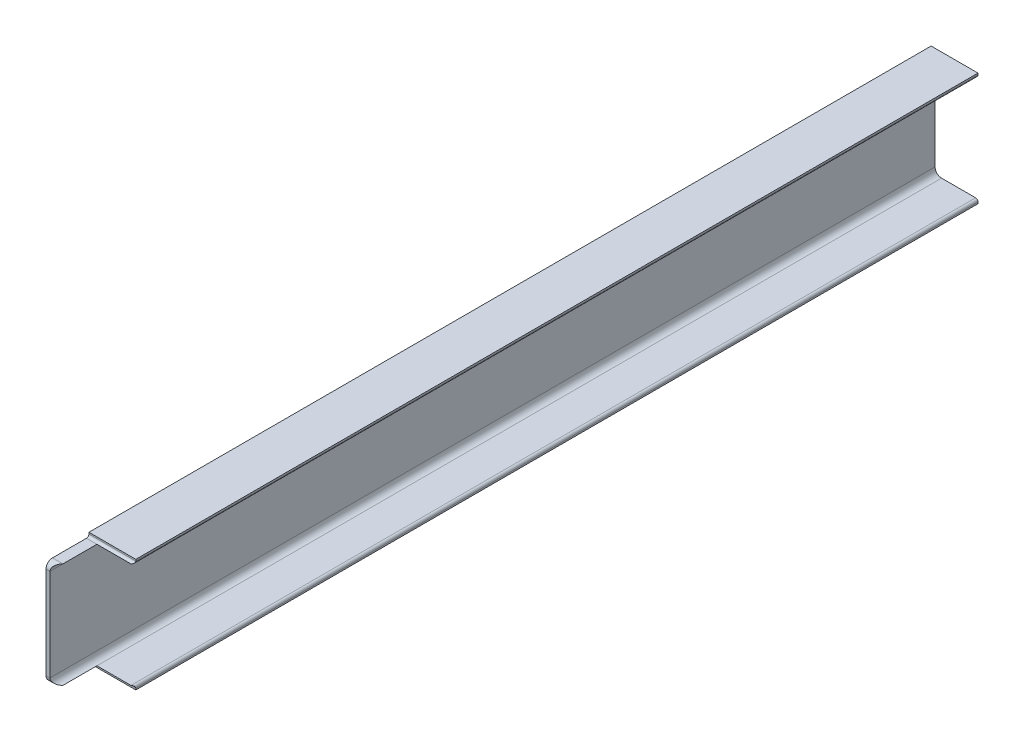
ISO-10303-21;
HEADER;
FILE_DESCRIPTION(('STEP AP214'),'2;1');
FILE_NAME('part.step','',(''),(''),'','','');
FILE_SCHEMA(('AUTOMOTIVE_DESIGN { 1 0 10303 214 1 1 1 1 }'));
ENDSEC;
DATA;
#1=APPLICATION_CONTEXT('core data for automotive mechanical design processes');
#2=APPLICATION_PROTOCOL_DEFINITION('international standard','automotive_design',2000,#1);
#3=PRODUCT_CONTEXT('',#1,'mechanical');
#4=PRODUCT('Part','Part','',(#3));
#5=PRODUCT_RELATED_PRODUCT_CATEGORY('part','',(#4));
#6=PRODUCT_DEFINITION_FORMATION('','',#4);
#7=PRODUCT_DEFINITION_CONTEXT('part definition',#1,'design');
#8=PRODUCT_DEFINITION('design','',#6,#7);
#9=PRODUCT_DEFINITION_SHAPE('','',#8);
#10=(LENGTH_UNIT() NAMED_UNIT(*) SI_UNIT(.MILLI.,.METRE.));
#11=(NAMED_UNIT(*) PLANE_ANGLE_UNIT() SI_UNIT($,.RADIAN.));
#12=(NAMED_UNIT(*) SI_UNIT($,.STERADIAN.) SOLID_ANGLE_UNIT());
#13=UNCERTAINTY_MEASURE_WITH_UNIT(LENGTH_MEASURE(1.E-05),#10,'distance_accuracy_value','');
#14=(GEOMETRIC_REPRESENTATION_CONTEXT(3) GLOBAL_UNCERTAINTY_ASSIGNED_CONTEXT((#13)) GLOBAL_UNIT_ASSIGNED_CONTEXT((#10,
#11,#12)) REPRESENTATION_CONTEXT('',''));
#15=CARTESIAN_POINT('',(0.,0.,0.));
#16=DIRECTION('',(0.,0.,1.));
#17=DIRECTION('',(1.,0.,0.));
#18=AXIS2_PLACEMENT_3D('',#15,#16,#17);
#19=CARTESIAN_POINT('',(0.,0.,-1100.));
#20=DIRECTION('',(0.,1.,0.));
#21=DIRECTION('',(-1.,0.,0.));
#22=AXIS2_PLACEMENT_3D('',#19,#20,#21);
#23=PLANE('',#22);
#24=DIRECTION('',(0.,0.,1.));
#25=VECTOR('',#24,1.);
#26=CARTESIAN_POINT('',(0.,0.,-1100.));
#27=LINE('',#26,#25);
#28=CARTESIAN_POINT('',(0.,0.,-1100.));
#29=VERTEX_POINT('',#28);
#30=CARTESIAN_POINT('',(0.,0.,-58.0000000000239));
#31=VERTEX_POINT('',#30);
#32=EDGE_CURVE('E207',#29,#31,#27,.T.);
#33=ORIENTED_EDGE('',*,*,#32,.T.);
#34=DIRECTION('',(-1.,0.,0.));
#35=VECTOR('',#34,1.);
#36=CARTESIAN_POINT('',(1603.56728673064,0.,-58.0000000000001));
#37=LINE('',#36,#35);
#38=CARTESIAN_POINT('',(58.,0.,-58.0000000000001));
#39=VERTEX_POINT('',#38);
#40=EDGE_CURVE('E67',#39,#31,#37,.T.);
#41=ORIENTED_EDGE('',*,*,#40,.F.);
#42=DIRECTION('',(0.,0.,1.));
#43=VECTOR('',#42,1.);
#44=CARTESIAN_POINT('',(58.,0.,-1100.));
#45=LINE('',#44,#43);
#46=CARTESIAN_POINT('',(58.,0.,-1100.));
#47=VERTEX_POINT('',#46);
#48=EDGE_CURVE('E74',#47,#39,#45,.T.);
#49=ORIENTED_EDGE('',*,*,#48,.F.);
#50=DIRECTION('',(-1.,0.,0.));
#51=VECTOR('',#50,1.);
#52=CARTESIAN_POINT('',(0.,0.,-1100.));
#53=LINE('',#52,#51);
#54=EDGE_CURVE('E192',#47,#29,#53,.T.);
#55=ORIENTED_EDGE('',*,*,#54,.T.);
#56=EDGE_LOOP('',(#33,#41,#49,#55));
#57=FACE_BOUND('',#56,.T.);
#58=ADVANCED_FACE('F52',(#57),#23,.T.);
#59=CARTESIAN_POINT('',(58.,0.,-1100.));
#60=DIRECTION('',(1.,0.,0.));
#61=DIRECTION('',(0.,1.,0.));
#62=AXIS2_PLACEMENT_3D('',#59,#60,#61);
#63=PLANE('',#62);
#64=ORIENTED_EDGE('',*,*,#48,.T.);
#65=DIRECTION('',(0.,-1.,0.));
#66=VECTOR('',#65,1.);
#67=CARTESIAN_POINT('',(58.,0.,-58.0000000000002));
#68=LINE('',#67,#66);
#69=CARTESIAN_POINT('',(58.,-1.90000000000001,-58.0000000000002));
#70=VERTEX_POINT('',#69);
#71=EDGE_CURVE('E181',#39,#70,#68,.T.);
#72=ORIENTED_EDGE('',*,*,#71,.T.);
#73=DIRECTION('',(0.,0.,1.));
#74=VECTOR('',#73,1.);
#75=CARTESIAN_POINT('',(58.,-1.90000000000001,-1100.));
#76=LINE('',#75,#74);
#77=CARTESIAN_POINT('',(58.,-1.90000000000001,-1100.));
#78=VERTEX_POINT('',#77);
#79=EDGE_CURVE('E332',#78,#70,#76,.T.);
#80=ORIENTED_EDGE('',*,*,#79,.F.);
#81=DIRECTION('',(0.,1.,0.));
#82=VECTOR('',#81,1.);
#83=CARTESIAN_POINT('',(58.,0.,-1100.));
#84=LINE('',#83,#82);
#85=EDGE_CURVE('E214',#78,#47,#84,.T.);
#86=ORIENTED_EDGE('',*,*,#85,.T.);
#87=EDGE_LOOP('',(#64,#72,#80,#86));
#88=FACE_BOUND('',#87,.T.);
#89=ADVANCED_FACE('F438',(#88),#63,.T.);
#90=CARTESIAN_POINT('',(54.9999999999999,-1.90000000000001,-1100.));
#91=DIRECTION('',(0.,0.,1.));
#92=DIRECTION('',(1.,0.,0.));
#93=AXIS2_PLACEMENT_3D('',#90,#91,#92);
#94=CYLINDRICAL_SURFACE('',#93,3.00000000000001);
#95=ORIENTED_EDGE('',*,*,#79,.T.);
#96=CARTESIAN_POINT('',(54.9999999999999,-1.90000000000001,-55.0000000000001));
#97=DIRECTION('',(0.707106781186548,0.,0.707106781186548));
#98=DIRECTION('',(-0.707106781186548,0.,0.707106781186548));
#99=AXIS2_PLACEMENT_3D('',#96,#97,#98);
#100=ELLIPSE('',#99,4.24264068711929,3.);
#101=CARTESIAN_POINT('',(54.9999999999999,-4.90000000000002,-55.0000000000001));
#102=VERTEX_POINT('',#101);
#103=EDGE_CURVE('E263',#70,#102,#100,.F.);
#104=ORIENTED_EDGE('',*,*,#103,.T.);
#105=DIRECTION('',(0.,0.,1.));
#106=VECTOR('',#105,1.);
#107=CARTESIAN_POINT('',(54.9999999999999,-4.90000000000002,-1100.));
#108=LINE('',#107,#106);
#109=CARTESIAN_POINT('',(54.9999999999999,-4.90000000000002,-1100.));
#110=VERTEX_POINT('',#109);
#111=EDGE_CURVE('E336',#110,#102,#108,.T.);
#112=ORIENTED_EDGE('',*,*,#111,.F.);
#113=CARTESIAN_POINT('',(54.9999999999999,-1.90000000000001,-1100.));
#114=DIRECTION('',(0.,0.,1.));
#115=DIRECTION('',(-1.,0.,0.));
#116=AXIS2_PLACEMENT_3D('',#113,#114,#115);
#117=CIRCLE('',#116,3.00000000000001);
#118=EDGE_CURVE('E323',#110,#78,#117,.T.);
#119=ORIENTED_EDGE('',*,*,#118,.T.);
#120=EDGE_LOOP('',(#95,#104,#112,#119));
#121=FACE_BOUND('',#120,.T.);
#122=ADVANCED_FACE('F440',(#121),#94,.T.);
#123=CARTESIAN_POINT('',(12.8999999999999,-12.9000000000001,-1100.));
#124=DIRECTION('',(0.,0.,1.));
#125=DIRECTION('',(1.,0.,0.));
#126=AXIS2_PLACEMENT_3D('',#123,#124,#125);
#127=CYLINDRICAL_SURFACE('',#126,8.);
#128=DIRECTION('',(0.,0.,1.));
#129=VECTOR('',#128,1.);
#130=CARTESIAN_POINT('',(12.8999999999999,-4.90000000000004,-1100.));
#131=LINE('',#130,#129);
#132=CARTESIAN_POINT('',(12.8999999999999,-4.90000000000002,-55.0000000000001));
#133=VERTEX_POINT('',#132);
#134=CARTESIAN_POINT('',(12.8999999999999,-4.90000000000002,-12.9));
#135=VERTEX_POINT('',#134);
#136=EDGE_CURVE('E267',#133,#135,#131,.T.);
#137=ORIENTED_EDGE('',*,*,#136,.T.);
#138=CARTESIAN_POINT('',(12.8999999999999,-12.9,-12.9));
#139=DIRECTION('',(0.707106781186548,0.,0.707106781186548));
#140=DIRECTION('',(-0.707106781186548,0.,0.707106781186548));
#141=AXIS2_PLACEMENT_3D('',#138,#139,#140);
#142=ELLIPSE('',#141,11.3137084989848,8.);
#143=CARTESIAN_POINT('',(4.8999999999999,-12.9,-4.9));
#144=VERTEX_POINT('',#143);
#145=EDGE_CURVE('E271',#135,#144,#142,.T.);
#146=ORIENTED_EDGE('',*,*,#145,.T.);
#147=DIRECTION('',(0.,0.,1.));
#148=VECTOR('',#147,1.);
#149=CARTESIAN_POINT('',(4.8999999999999,-12.9000000000001,-1100.));
#150=LINE('',#149,#148);
#151=CARTESIAN_POINT('',(4.8999999999999,-12.9000000000001,-1100.));
#152=VERTEX_POINT('',#151);
#153=EDGE_CURVE('E344',#152,#144,#150,.T.);
#154=ORIENTED_EDGE('',*,*,#153,.F.);
#155=CARTESIAN_POINT('',(12.8999999999999,-12.9000000000001,-1100.));
#156=DIRECTION('',(0.,0.,-1.));
#157=DIRECTION('',(1.,0.,0.));
#158=AXIS2_PLACEMENT_3D('',#155,#156,#157);
#159=CIRCLE('',#158,8.);
#160=CARTESIAN_POINT('',(12.8999999999999,-4.90000000000004,-1100.));
#161=VERTEX_POINT('',#160);
#162=EDGE_CURVE('E315',#152,#161,#159,.T.);
#163=ORIENTED_EDGE('',*,*,#162,.T.);
#164=DIRECTION('',(0.,0.,1.));
#165=VECTOR('',#164,1.);
#166=CARTESIAN_POINT('',(12.8999999999999,-4.90000000000004,-1100.));
#167=LINE('',#166,#165);
#168=EDGE_CURVE('E340',#161,#133,#167,.T.);
#169=ORIENTED_EDGE('',*,*,#168,.T.);
#170=EDGE_LOOP('',(#137,#146,#154,#163,#169));
#171=FACE_BOUND('',#170,.T.);
#172=ADVANCED_FACE('F422',(#171),#127,.F.);
#173=CARTESIAN_POINT('',(4.8999999999999,-12.9000000000001,-1100.));
#174=DIRECTION('',(1.,0.,0.));
#175=DIRECTION('',(0.,1.,0.));
#176=AXIS2_PLACEMENT_3D('',#173,#174,#175);
#177=PLANE('',#176);
#178=ORIENTED_EDGE('',*,*,#153,.T.);
#179=DIRECTION('',(0.,-1.,0.));
#180=VECTOR('',#179,1.);
#181=CARTESIAN_POINT('',(4.8999999999999,-12.9000000000002,-4.89999999999991));
#182=LINE('',#181,#180);
#183=CARTESIAN_POINT('',(4.8999999999999,-127.1,-4.89999999999991));
#184=VERTEX_POINT('',#183);
#185=EDGE_CURVE('E275',#144,#184,#182,.T.);
#186=ORIENTED_EDGE('',*,*,#185,.T.);
#187=DIRECTION('',(0.,0.,1.));
#188=VECTOR('',#187,1.);
#189=CARTESIAN_POINT('',(4.8999999999999,-127.1,-1100.));
#190=LINE('',#189,#188);
#191=CARTESIAN_POINT('',(4.8999999999999,-127.1,-1100.));
#192=VERTEX_POINT('',#191);
#193=EDGE_CURVE('E348',#192,#184,#190,.T.);
#194=ORIENTED_EDGE('',*,*,#193,.F.);
#195=DIRECTION('',(0.,1.,0.));
#196=VECTOR('',#195,1.);
#197=CARTESIAN_POINT('',(4.8999999999999,-12.9000000000001,-1100.));
#198=LINE('',#197,#196);
#199=EDGE_CURVE('E311',#192,#152,#198,.T.);
#200=ORIENTED_EDGE('',*,*,#199,.T.);
#201=EDGE_LOOP('',(#178,#186,#194,#200));
#202=FACE_BOUND('',#201,.T.);
#203=ADVANCED_FACE('F425',(#202),#177,.T.);
#204=CARTESIAN_POINT('',(12.8999999999999,-127.1,-1100.));
#205=DIRECTION('',(0.,0.,1.));
#206=DIRECTION('',(1.,0.,0.));
#207=AXIS2_PLACEMENT_3D('',#204,#205,#206);
#208=CYLINDRICAL_SURFACE('',#207,8.);
#209=ORIENTED_EDGE('',*,*,#193,.T.);
#210=CARTESIAN_POINT('',(12.8999999999999,-127.1,-12.9));
#211=DIRECTION('',(0.707106781186548,0.,0.707106781186548));
#212=DIRECTION('',(-0.707106781186548,0.,0.707106781186548));
#213=AXIS2_PLACEMENT_3D('',#210,#211,#212);
#214=ELLIPSE('',#213,11.3137084989848,8.);
#215=CARTESIAN_POINT('',(12.8999999999999,-135.1,-12.9));
#216=VERTEX_POINT('',#215);
#217=EDGE_CURVE('E279',#184,#216,#214,.T.);
#218=ORIENTED_EDGE('',*,*,#217,.T.);
#219=DIRECTION('',(0.,0.,1.));
#220=VECTOR('',#219,1.);
#221=CARTESIAN_POINT('',(12.8999999999999,-135.100000000001,-1100.));
#222=LINE('',#221,#220);
#223=CARTESIAN_POINT('',(12.8999999999999,-135.1,-55.));
#224=VERTEX_POINT('',#223);
#225=EDGE_CURVE('E283',#224,#216,#222,.T.);
#226=ORIENTED_EDGE('',*,*,#225,.F.);
#227=DIRECTION('',(0.,0.,1.));
#228=VECTOR('',#227,1.);
#229=CARTESIAN_POINT('',(12.8999999999999,-135.1,-1100.));
#230=LINE('',#229,#228);
#231=CARTESIAN_POINT('',(12.8999999999999,-135.1,-1100.));
#232=VERTEX_POINT('',#231);
#233=EDGE_CURVE('E352',#232,#224,#230,.T.);
#234=ORIENTED_EDGE('',*,*,#233,.F.);
#235=CARTESIAN_POINT('',(12.8999999999999,-127.1,-1100.));
#236=DIRECTION('',(0.,0.,-1.));
#237=DIRECTION('',(-1.,0.,0.));
#238=AXIS2_PLACEMENT_3D('',#235,#236,#237);
#239=CIRCLE('',#238,8.);
#240=EDGE_CURVE('E307',#232,#192,#239,.T.);
#241=ORIENTED_EDGE('',*,*,#240,.T.);
#242=EDGE_LOOP('',(#209,#218,#226,#234,#241));
#243=FACE_BOUND('',#242,.T.);
#244=ADVANCED_FACE('F371',(#243),#208,.F.);
#245=CARTESIAN_POINT('',(54.9999999999999,-135.1,-1100.));
#246=DIRECTION('',(0.,1.,0.));
#247=DIRECTION('',(-1.,0.,0.));
#248=AXIS2_PLACEMENT_3D('',#245,#246,#247);
#249=PLANE('',#248);
#250=ORIENTED_EDGE('',*,*,#233,.T.);
#251=DIRECTION('',(-1.,0.,0.));
#252=VECTOR('',#251,1.);
#253=CARTESIAN_POINT('',(1603.56728673064,-135.1,-55.));
#254=LINE('',#253,#252);
#255=CARTESIAN_POINT('',(54.9999999999999,-135.1,-55.));
#256=VERTEX_POINT('',#255);
#257=EDGE_CURVE('E253',#256,#224,#254,.T.);
#258=ORIENTED_EDGE('',*,*,#257,.F.);
#259=DIRECTION('',(0.,0.,1.));
#260=VECTOR('',#259,1.);
#261=CARTESIAN_POINT('',(54.9999999999999,-135.1,-1100.));
#262=LINE('',#261,#260);
#263=CARTESIAN_POINT('',(54.9999999999999,-135.1,-1100.));
#264=VERTEX_POINT('',#263);
#265=EDGE_CURVE('E205',#264,#256,#262,.T.);
#266=ORIENTED_EDGE('',*,*,#265,.F.);
#267=DIRECTION('',(-1.,0.,0.));
#268=VECTOR('',#267,1.);
#269=CARTESIAN_POINT('',(54.9999999999999,-135.1,-1100.));
#270=LINE('',#269,#268);
#271=EDGE_CURVE('E303',#264,#232,#270,.T.);
#272=ORIENTED_EDGE('',*,*,#271,.T.);
#273=EDGE_LOOP('',(#250,#258,#266,#272));
#274=FACE_BOUND('',#273,.T.);
#275=ADVANCED_FACE('F364',(#274),#249,.T.);
#276=CARTESIAN_POINT('',(54.9999999999999,-138.1,-1100.));
#277=DIRECTION('',(0.,0.,1.));
#278=DIRECTION('',(1.,0.,0.));
#279=AXIS2_PLACEMENT_3D('',#276,#277,#278);
#280=CYLINDRICAL_SURFACE('',#279,2.99999999999999);
#281=ORIENTED_EDGE('',*,*,#265,.T.);
#282=CARTESIAN_POINT('',(54.9999999999999,-138.1,-55.0000000000001));
#283=DIRECTION('',(0.707106781186548,0.,0.707106781186548));
#284=DIRECTION('',(-0.707106781186548,0.,0.707106781186548));
#285=AXIS2_PLACEMENT_3D('',#282,#283,#284);
#286=ELLIPSE('',#285,4.24264068711927,2.99999999999999);
#287=CARTESIAN_POINT('',(58.,-138.1,-58.0000000000001));
#288=VERTEX_POINT('',#287);
#289=EDGE_CURVE('E193',#256,#288,#286,.F.);
#290=ORIENTED_EDGE('',*,*,#289,.T.);
#291=DIRECTION('',(0.,0.,1.));
#292=VECTOR('',#291,1.);
#293=CARTESIAN_POINT('',(58.,-138.1,-1100.));
#294=LINE('',#293,#292);
#295=CARTESIAN_POINT('',(58.,-138.1,-1100.));
#296=VERTEX_POINT('',#295);
#297=EDGE_CURVE('E190',#296,#288,#294,.T.);
#298=ORIENTED_EDGE('',*,*,#297,.F.);
#299=CARTESIAN_POINT('',(54.9999999999999,-138.1,-1100.));
#300=DIRECTION('',(0.,0.,1.));
#301=DIRECTION('',(1.,0.,0.));
#302=AXIS2_PLACEMENT_3D('',#299,#300,#301);
#303=CIRCLE('',#302,2.99999999999999);
#304=EDGE_CURVE('E299',#296,#264,#303,.T.);
#305=ORIENTED_EDGE('',*,*,#304,.T.);
#306=EDGE_LOOP('',(#281,#290,#298,#305));
#307=FACE_BOUND('',#306,.T.);
#308=ADVANCED_FACE('F359',(#307),#280,.T.);
#309=CARTESIAN_POINT('',(0.,-140.,-1100.));
#310=DIRECTION('',(0.,-1.,0.));
#311=DIRECTION('',(0.,0.,-1.));
#312=AXIS2_PLACEMENT_3D('',#309,#310,#311);
#313=PLANE('',#312);
#314=DIRECTION('',(0.,0.,1.));
#315=VECTOR('',#314,1.);
#316=CARTESIAN_POINT('',(58.,-140.,-1100.));
#317=LINE('',#316,#315);
#318=CARTESIAN_POINT('',(58.,-140.,-1100.));
#319=VERTEX_POINT('',#318);
#320=CARTESIAN_POINT('',(58.,-140.,-58.0000000000001));
#321=VERTEX_POINT('',#320);
#322=EDGE_CURVE('E188',#319,#321,#317,.T.);
#323=ORIENTED_EDGE('',*,*,#322,.T.);
#324=DIRECTION('',(-1.,0.,0.));
#325=VECTOR('',#324,1.);
#326=CARTESIAN_POINT('',(1603.56728673064,-140.,-58.0000000000001));
#327=LINE('',#326,#325);
#328=CARTESIAN_POINT('',(0.,-140.,-58.0000000000001));
#329=VERTEX_POINT('',#328);
#330=EDGE_CURVE('E171',#321,#329,#327,.T.);
#331=ORIENTED_EDGE('',*,*,#330,.T.);
#332=DIRECTION('',(0.,0.,1.));
#333=VECTOR('',#332,1.);
#334=CARTESIAN_POINT('',(0.,-140.,-1100.));
#335=LINE('',#334,#333);
#336=CARTESIAN_POINT('',(0.,-140.,-1100.));
#337=VERTEX_POINT('',#336);
#338=EDGE_CURVE('E200',#337,#329,#335,.T.);
#339=ORIENTED_EDGE('',*,*,#338,.F.);
#340=DIRECTION('',(1.,0.,0.));
#341=VECTOR('',#340,1.);
#342=CARTESIAN_POINT('',(0.,-140.,-1100.));
#343=LINE('',#342,#341);
#344=EDGE_CURVE('E198',#337,#319,#343,.T.);
#345=ORIENTED_EDGE('',*,*,#344,.T.);
#346=EDGE_LOOP('',(#323,#331,#339,#345));
#347=FACE_BOUND('',#346,.T.);
#348=ADVANCED_FACE('F196',(#347),#313,.T.);
#349=CARTESIAN_POINT('',(0.,-140.,-1100.));
#350=DIRECTION('',(-1.,0.,0.));
#351=DIRECTION('',(0.,-1.,0.));
#352=AXIS2_PLACEMENT_3D('',#349,#350,#351);
#353=PLANE('',#352);
#354=ORIENTED_EDGE('',*,*,#338,.T.);
#355=DIRECTION('',(0.,1.,0.));
#356=VECTOR('',#355,1.);
#357=CARTESIAN_POINT('',(0.,-140.000000000008,-58.0000000000002));
#358=LINE('',#357,#356);
#359=CARTESIAN_POINT('',(0.,-138.1,-58.0000000000001));
#360=VERTEX_POINT('',#359);
#361=EDGE_CURVE('E13',#329,#360,#358,.T.);
#362=ORIENTED_EDGE('',*,*,#361,.T.);
#363=CARTESIAN_POINT('',(0.,-138.1,-55.0000000000001));
#364=DIRECTION('',(-1.,0.,0.));
#365=DIRECTION('',(0.,-1.,0.));
#366=AXIS2_PLACEMENT_3D('',#363,#364,#365);
#367=CIRCLE('',#366,2.99999999999999);
#368=CARTESIAN_POINT('',(0.,-135.1,-55.));
#369=VERTEX_POINT('',#368);
#370=EDGE_CURVE('E60',#360,#369,#367,.F.);
#371=ORIENTED_EDGE('',*,*,#370,.T.);
#372=DIRECTION('',(0.,0.,1.));
#373=VECTOR('',#372,1.);
#374=CARTESIAN_POINT('',(0.,-135.100000000003,-1100.));
#375=LINE('',#374,#373);
#376=CARTESIAN_POINT('',(0.,-135.1,-12.9));
#377=VERTEX_POINT('',#376);
#378=EDGE_CURVE('E238',#369,#377,#375,.T.);
#379=ORIENTED_EDGE('',*,*,#378,.T.);
#380=CARTESIAN_POINT('',(0.,-127.1,-12.9));
#381=DIRECTION('',(-1.,0.,0.));
#382=DIRECTION('',(0.,-1.,0.));
#383=AXIS2_PLACEMENT_3D('',#380,#381,#382);
#384=CIRCLE('',#383,8.);
#385=CARTESIAN_POINT('',(0.,-127.1,-4.9));
#386=VERTEX_POINT('',#385);
#387=EDGE_CURVE('E234',#377,#386,#384,.T.);
#388=ORIENTED_EDGE('',*,*,#387,.T.);
#389=DIRECTION('',(0.,1.,0.));
#390=VECTOR('',#389,1.);
#391=CARTESIAN_POINT('',(0.,-140.,-4.89999999999991));
#392=LINE('',#391,#390);
#393=CARTESIAN_POINT('',(0.,-12.9,-4.9));
#394=VERTEX_POINT('',#393);
#395=EDGE_CURVE('E230',#386,#394,#392,.T.);
#396=ORIENTED_EDGE('',*,*,#395,.T.);
#397=CARTESIAN_POINT('',(0.,-12.9,-12.9));
#398=DIRECTION('',(-1.,0.,0.));
#399=DIRECTION('',(0.,-1.,0.));
#400=AXIS2_PLACEMENT_3D('',#397,#398,#399);
#401=CIRCLE('',#400,8.);
#402=CARTESIAN_POINT('',(0.,-4.90000000000002,-12.9));
#403=VERTEX_POINT('',#402);
#404=EDGE_CURVE('E226',#394,#403,#401,.T.);
#405=ORIENTED_EDGE('',*,*,#404,.T.);
#406=DIRECTION('',(0.,0.,-1.));
#407=VECTOR('',#406,1.);
#408=CARTESIAN_POINT('',(0.,-4.90000000000002,-1100.));
#409=LINE('',#408,#407);
#410=CARTESIAN_POINT('',(0.,-4.90000000000004,-55.0000000000001));
#411=VERTEX_POINT('',#410);
#412=EDGE_CURVE('E222',#403,#411,#409,.T.);
#413=ORIENTED_EDGE('',*,*,#412,.T.);
#414=CARTESIAN_POINT('',(0.,-1.90000000000004,-55.0000000000001));
#415=DIRECTION('',(-1.,0.,0.));
#416=DIRECTION('',(0.,-1.,0.));
#417=AXIS2_PLACEMENT_3D('',#414,#415,#416);
#418=CIRCLE('',#417,3.);
#419=CARTESIAN_POINT('',(0.,-1.90000000000001,-58.0000000000001));
#420=VERTEX_POINT('',#419);
#421=EDGE_CURVE('E218',#411,#420,#418,.F.);
#422=ORIENTED_EDGE('',*,*,#421,.T.);
#423=DIRECTION('',(0.,1.,0.));
#424=VECTOR('',#423,1.);
#425=CARTESIAN_POINT('',(0.,-140.,-58.0000000000002));
#426=LINE('',#425,#424);
#427=EDGE_CURVE('E215',#420,#31,#426,.T.);
#428=ORIENTED_EDGE('',*,*,#427,.T.);
#429=ORIENTED_EDGE('',*,*,#32,.F.);
#430=DIRECTION('',(0.,-1.,0.));
#431=VECTOR('',#430,1.);
#432=CARTESIAN_POINT('',(0.,-140.,-1100.));
#433=LINE('',#432,#431);
#434=EDGE_CURVE('E290',#29,#337,#433,.T.);
#435=ORIENTED_EDGE('',*,*,#434,.T.);
#436=EDGE_LOOP('',(#354,#362,#371,#379,#388,#396,#405,#413,#422,#428,#429,#435));
#437=FACE_BOUND('',#436,.T.);
#438=ADVANCED_FACE('F245',(#437),#353,.T.);
#439=CARTESIAN_POINT('',(54.9999999999999,-4.90000000000002,-1100.));
#440=DIRECTION('',(0.,-1.,0.));
#441=DIRECTION('',(0.,0.,-1.));
#442=AXIS2_PLACEMENT_3D('',#439,#440,#441);
#443=PLANE('',#442);
#444=DIRECTION('',(-1.,0.,0.));
#445=VECTOR('',#444,1.);
#446=CARTESIAN_POINT('',(1603.56728673064,-4.90000000000002,-55.0000000000001));
#447=LINE('',#446,#445);
#448=EDGE_CURVE('E397',#102,#133,#447,.T.);
#449=ORIENTED_EDGE('',*,*,#448,.T.);
#450=ORIENTED_EDGE('',*,*,#168,.F.);
#451=DIRECTION('',(1.,0.,0.));
#452=VECTOR('',#451,1.);
#453=CARTESIAN_POINT('',(54.9999999999999,-4.90000000000002,-1100.));
#454=LINE('',#453,#452);
#455=EDGE_CURVE('E319',#161,#110,#454,.T.);
#456=ORIENTED_EDGE('',*,*,#455,.T.);
#457=ORIENTED_EDGE('',*,*,#111,.T.);
#458=EDGE_LOOP('',(#449,#450,#456,#457));
#459=FACE_BOUND('',#458,.T.);
#460=ADVANCED_FACE('F417',(#459),#443,.T.);
#461=CARTESIAN_POINT('',(58.,-140.,-1100.));
#462=DIRECTION('',(1.,0.,0.));
#463=DIRECTION('',(0.,1.,0.));
#464=AXIS2_PLACEMENT_3D('',#461,#462,#463);
#465=PLANE('',#464);
#466=ORIENTED_EDGE('',*,*,#297,.T.);
#467=DIRECTION('',(0.,-1.,0.));
#468=VECTOR('',#467,1.);
#469=CARTESIAN_POINT('',(58.,-140.000000000008,-58.0000000000002));
#470=LINE('',#469,#468);
#471=EDGE_CURVE('E175',#288,#321,#470,.T.);
#472=ORIENTED_EDGE('',*,*,#471,.T.);
#473=ORIENTED_EDGE('',*,*,#322,.F.);
#474=DIRECTION('',(0.,1.,0.));
#475=VECTOR('',#474,1.);
#476=CARTESIAN_POINT('',(58.,-140.,-1100.));
#477=LINE('',#476,#475);
#478=EDGE_CURVE('E296',#319,#296,#477,.T.);
#479=ORIENTED_EDGE('',*,*,#478,.T.);
#480=EDGE_LOOP('',(#466,#472,#473,#479));
#481=FACE_BOUND('',#480,.T.);
#482=ADVANCED_FACE('F186',(#481),#465,.T.);
#483=CARTESIAN_POINT('',(54.9999999999999,-1.90000000000001,-1100.));
#484=DIRECTION('',(0.,0.,-1.));
#485=DIRECTION('',(-1.,0.,0.));
#486=AXIS2_PLACEMENT_3D('',#483,#484,#485);
#487=PLANE('',#486);
#488=ORIENTED_EDGE('',*,*,#54,.F.);
#489=ORIENTED_EDGE('',*,*,#85,.F.);
#490=ORIENTED_EDGE('',*,*,#118,.F.);
#491=ORIENTED_EDGE('',*,*,#455,.F.);
#492=ORIENTED_EDGE('',*,*,#162,.F.);
#493=ORIENTED_EDGE('',*,*,#199,.F.);
#494=ORIENTED_EDGE('',*,*,#240,.F.);
#495=ORIENTED_EDGE('',*,*,#271,.F.);
#496=ORIENTED_EDGE('',*,*,#304,.F.);
#497=ORIENTED_EDGE('',*,*,#478,.F.);
#498=ORIENTED_EDGE('',*,*,#344,.F.);
#499=ORIENTED_EDGE('',*,*,#434,.F.);
#500=EDGE_LOOP('',(#488,#489,#490,#491,#492,#493,#494,#495,#496,#497,#498,#499));
#501=FACE_BOUND('',#500,.T.);
#502=ADVANCED_FACE('F367',(#501),#487,.T.);
#503=CARTESIAN_POINT('',(1603.56728673064,-135.1,-55.));
#504=DIRECTION('',(0.,-1.,0.));
#505=DIRECTION('',(0.,0.,-1.));
#506=AXIS2_PLACEMENT_3D('',#503,#504,#505);
#507=PLANE('',#506);
#508=ORIENTED_EDGE('',*,*,#225,.T.);
#509=DIRECTION('',(-1.,0.,0.));
#510=VECTOR('',#509,1.);
#511=CARTESIAN_POINT('',(1603.56728673064,-135.1,-12.9));
#512=LINE('',#511,#510);
#513=EDGE_CURVE('E377',#216,#377,#512,.T.);
#514=ORIENTED_EDGE('',*,*,#513,.T.);
#515=ORIENTED_EDGE('',*,*,#378,.F.);
#516=EDGE_CURVE('E251',#224,#369,#254,.T.);
#517=ORIENTED_EDGE('',*,*,#516,.F.);
#518=EDGE_LOOP('',(#508,#514,#515,#517));
#519=FACE_BOUND('',#518,.T.);
#520=ADVANCED_FACE('F376',(#519),#507,.T.);
#521=CARTESIAN_POINT('',(1603.56728673064,-140.,-58.0000000000001));
#522=DIRECTION('',(0.,0.,1.));
#523=DIRECTION('',(0.,-1.,0.));
#524=AXIS2_PLACEMENT_3D('',#521,#522,#523);
#525=PLANE('',#524);
#526=DIRECTION('',(-1.,0.,0.));
#527=VECTOR('',#526,1.);
#528=CARTESIAN_POINT('',(1603.56728673064,-138.1,-58.0000000000001));
#529=LINE('',#528,#527);
#530=EDGE_CURVE('E182',#288,#360,#529,.T.);
#531=ORIENTED_EDGE('',*,*,#530,.T.);
#532=ORIENTED_EDGE('',*,*,#361,.F.);
#533=ORIENTED_EDGE('',*,*,#330,.F.);
#534=ORIENTED_EDGE('',*,*,#471,.F.);
#535=EDGE_LOOP('',(#531,#532,#533,#534));
#536=FACE_BOUND('',#535,.T.);
#537=ADVANCED_FACE('F174',(#536),#525,.T.);
#538=CARTESIAN_POINT('',(1603.56728673064,-138.1,-55.0000000000001));
#539=DIRECTION('',(-1.,0.,0.));
#540=DIRECTION('',(0.,0.,1.));
#541=AXIS2_PLACEMENT_3D('',#538,#539,#540);
#542=CYLINDRICAL_SURFACE('',#541,2.99999999999999);
#543=ORIENTED_EDGE('',*,*,#257,.T.);
#544=ORIENTED_EDGE('',*,*,#516,.T.);
#545=ORIENTED_EDGE('',*,*,#370,.F.);
#546=ORIENTED_EDGE('',*,*,#530,.F.);
#547=ORIENTED_EDGE('',*,*,#289,.F.);
#548=EDGE_LOOP('',(#543,#544,#545,#546,#547));
#549=FACE_BOUND('',#548,.T.);
#550=ADVANCED_FACE('F249',(#549),#542,.F.);
#551=CARTESIAN_POINT('',(1603.56728673064,-127.1,-12.9));
#552=DIRECTION('',(-1.,0.,0.));
#553=DIRECTION('',(0.,0.,1.));
#554=AXIS2_PLACEMENT_3D('',#551,#552,#553);
#555=CYLINDRICAL_SURFACE('',#554,8.);
#556=DIRECTION('',(-1.,0.,0.));
#557=VECTOR('',#556,1.);
#558=CARTESIAN_POINT('',(1603.56728673064,-127.1,-4.9));
#559=LINE('',#558,#557);
#560=EDGE_CURVE('E383',#184,#386,#559,.T.);
#561=ORIENTED_EDGE('',*,*,#560,.T.);
#562=ORIENTED_EDGE('',*,*,#387,.F.);
#563=ORIENTED_EDGE('',*,*,#513,.F.);
#564=ORIENTED_EDGE('',*,*,#217,.F.);
#565=EDGE_LOOP('',(#561,#562,#563,#564));
#566=FACE_BOUND('',#565,.T.);
#567=ADVANCED_FACE('F380',(#566),#555,.T.);
#568=CARTESIAN_POINT('',(1603.56728673064,-12.9,-4.9));
#569=DIRECTION('',(0.,0.,1.));
#570=DIRECTION('',(0.,-1.,0.));
#571=AXIS2_PLACEMENT_3D('',#568,#569,#570);
#572=PLANE('',#571);
#573=DIRECTION('',(-1.,0.,0.));
#574=VECTOR('',#573,1.);
#575=CARTESIAN_POINT('',(1603.56728673064,-12.9,-4.9));
#576=LINE('',#575,#574);
#577=EDGE_CURVE('E387',#144,#394,#576,.T.);
#578=ORIENTED_EDGE('',*,*,#577,.T.);
#579=ORIENTED_EDGE('',*,*,#395,.F.);
#580=ORIENTED_EDGE('',*,*,#560,.F.);
#581=ORIENTED_EDGE('',*,*,#185,.F.);
#582=EDGE_LOOP('',(#578,#579,#580,#581));
#583=FACE_BOUND('',#582,.T.);
#584=ADVANCED_FACE('F428',(#583),#572,.T.);
#585=CARTESIAN_POINT('',(1603.56728673064,-12.9,-12.9));
#586=DIRECTION('',(-1.,0.,0.));
#587=DIRECTION('',(0.,0.,1.));
#588=AXIS2_PLACEMENT_3D('',#585,#586,#587);
#589=CYLINDRICAL_SURFACE('',#588,8.);
#590=DIRECTION('',(-1.,0.,0.));
#591=VECTOR('',#590,1.);
#592=CARTESIAN_POINT('',(1603.56728673064,-4.90000000000002,-12.9));
#593=LINE('',#592,#591);
#594=EDGE_CURVE('E393',#135,#403,#593,.T.);
#595=ORIENTED_EDGE('',*,*,#594,.T.);
#596=ORIENTED_EDGE('',*,*,#404,.F.);
#597=ORIENTED_EDGE('',*,*,#577,.F.);
#598=ORIENTED_EDGE('',*,*,#145,.F.);
#599=EDGE_LOOP('',(#595,#596,#597,#598));
#600=FACE_BOUND('',#599,.T.);
#601=ADVANCED_FACE('F430',(#600),#589,.T.);
#602=CARTESIAN_POINT('',(1603.56728673064,-4.90000000000002,-55.0000000000001));
#603=DIRECTION('',(0.,1.,0.));
#604=DIRECTION('',(0.,0.,1.));
#605=AXIS2_PLACEMENT_3D('',#602,#603,#604);
#606=PLANE('',#605);
#607=EDGE_CURVE('E398',#133,#411,#447,.T.);
#608=ORIENTED_EDGE('',*,*,#607,.T.);
#609=ORIENTED_EDGE('',*,*,#412,.F.);
#610=ORIENTED_EDGE('',*,*,#594,.F.);
#611=ORIENTED_EDGE('',*,*,#136,.F.);
#612=EDGE_LOOP('',(#608,#609,#610,#611));
#613=FACE_BOUND('',#612,.T.);
#614=ADVANCED_FACE('F433',(#613),#606,.T.);
#615=CARTESIAN_POINT('',(1603.56728673064,-1.90000000000001,-55.0000000000001));
#616=DIRECTION('',(-1.,0.,0.));
#617=DIRECTION('',(0.,0.,1.));
#618=AXIS2_PLACEMENT_3D('',#615,#616,#617);
#619=CYLINDRICAL_SURFACE('',#618,3.);
#620=DIRECTION('',(-1.,0.,0.));
#621=VECTOR('',#620,1.);
#622=CARTESIAN_POINT('',(1603.56728673064,-1.90000000000001,-58.0000000000001));
#623=LINE('',#622,#621);
#624=EDGE_CURVE('E402',#70,#420,#623,.T.);
#625=ORIENTED_EDGE('',*,*,#624,.T.);
#626=ORIENTED_EDGE('',*,*,#421,.F.);
#627=ORIENTED_EDGE('',*,*,#607,.F.);
#628=ORIENTED_EDGE('',*,*,#448,.F.);
#629=ORIENTED_EDGE('',*,*,#103,.F.);
#630=EDGE_LOOP('',(#625,#626,#627,#628,#629));
#631=FACE_BOUND('',#630,.T.);
#632=ADVANCED_FACE('F434',(#631),#619,.F.);
#633=CARTESIAN_POINT('',(1603.56728673064,0.,-58.0000000000001));
#634=DIRECTION('',(0.,0.,1.));
#635=DIRECTION('',(1.,0.,0.));
#636=AXIS2_PLACEMENT_3D('',#633,#634,#635);
#637=PLANE('',#636);
#638=ORIENTED_EDGE('',*,*,#40,.T.);
#639=ORIENTED_EDGE('',*,*,#427,.F.);
#640=ORIENTED_EDGE('',*,*,#624,.F.);
#641=ORIENTED_EDGE('',*,*,#71,.F.);
#642=EDGE_LOOP('',(#638,#639,#640,#641));
#643=FACE_BOUND('',#642,.T.);
#644=ADVANCED_FACE('F436',(#643),#637,.T.);
#645=CLOSED_SHELL('',(#58,#89,#122,#172,#203,#244,#275,#308,#348,#438,#460,#482,#502,#520,#537,
#550,#567,#584,#601,#614,#632,#644));
#646=MANIFOLD_SOLID_BREP('B2',#645);
#647=ADVANCED_BREP_SHAPE_REPRESENTATION('',(#18,#646),#14);
#648=SHAPE_DEFINITION_REPRESENTATION(#9,#647);
ENDSEC;
END-ISO-10303-21;
